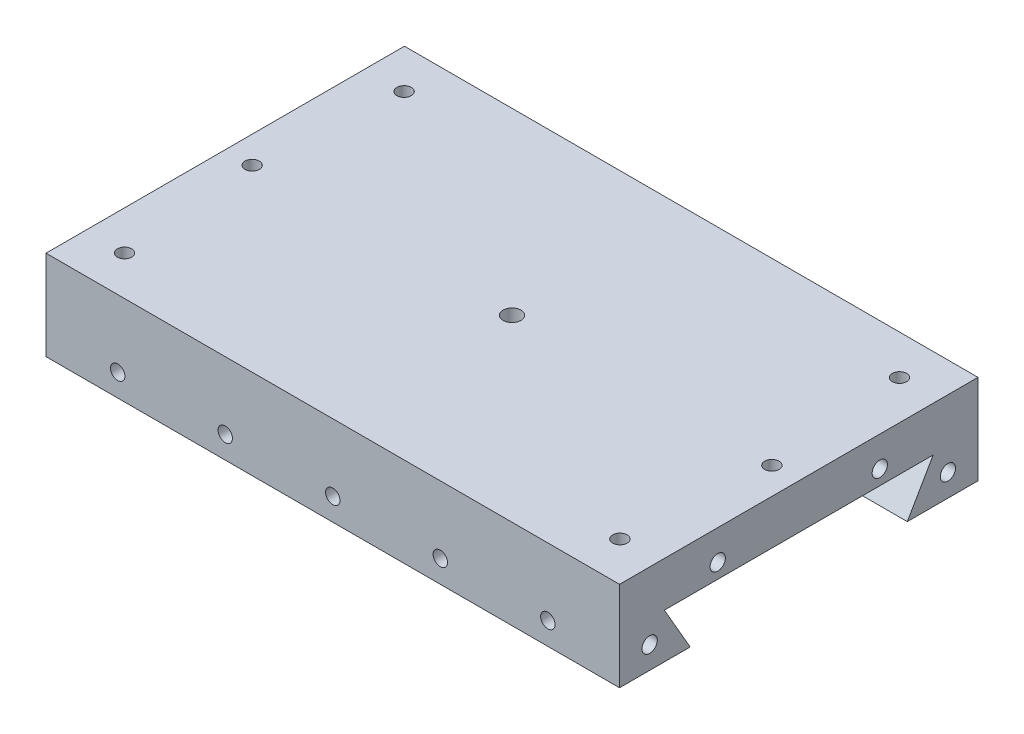
ISO-10303-21;
HEADER;
FILE_DESCRIPTION(('STEP AP214'),'2;1');
FILE_NAME('part.step','',(''),(''),'','','');
FILE_SCHEMA(('AUTOMOTIVE_DESIGN { 1 0 10303 214 1 1 1 1 }'));
ENDSEC;
DATA;
#1=APPLICATION_CONTEXT('core data for automotive mechanical design processes');
#2=APPLICATION_PROTOCOL_DEFINITION('international standard','automotive_design',2000,#1);
#3=PRODUCT_CONTEXT('',#1,'mechanical');
#4=PRODUCT('Part','Part','',(#3));
#5=PRODUCT_RELATED_PRODUCT_CATEGORY('part','',(#4));
#6=PRODUCT_DEFINITION_FORMATION('','',#4);
#7=PRODUCT_DEFINITION_CONTEXT('part definition',#1,'design');
#8=PRODUCT_DEFINITION('design','',#6,#7);
#9=PRODUCT_DEFINITION_SHAPE('','',#8);
#10=(LENGTH_UNIT() NAMED_UNIT(*) SI_UNIT(.MILLI.,.METRE.));
#11=(NAMED_UNIT(*) PLANE_ANGLE_UNIT() SI_UNIT($,.RADIAN.));
#12=(NAMED_UNIT(*) SI_UNIT($,.STERADIAN.) SOLID_ANGLE_UNIT());
#13=UNCERTAINTY_MEASURE_WITH_UNIT(LENGTH_MEASURE(1.E-05),#10,'distance_accuracy_value','');
#14=(GEOMETRIC_REPRESENTATION_CONTEXT(3) GLOBAL_UNCERTAINTY_ASSIGNED_CONTEXT((#13)) GLOBAL_UNIT_ASSIGNED_CONTEXT((#10,
#11,#12)) REPRESENTATION_CONTEXT('',''));
#15=CARTESIAN_POINT('',(0.,0.,0.));
#16=DIRECTION('',(0.,0.,1.));
#17=DIRECTION('',(1.,0.,0.));
#18=AXIS2_PLACEMENT_3D('',#15,#16,#17);
#19=CARTESIAN_POINT('',(203.2,0.,0.));
#20=DIRECTION('',(0.,-1.,0.));
#21=DIRECTION('',(0.,0.,-1.));
#22=AXIS2_PLACEMENT_3D('',#19,#20,#21);
#23=PLANE('',#22);
#24=DIRECTION('',(0.,0.,1.));
#25=VECTOR('',#24,1.);
#26=CARTESIAN_POINT('',(0.,0.,0.));
#27=LINE('',#26,#25);
#28=CARTESIAN_POINT('',(0.,0.,38.4595644766147));
#29=VERTEX_POINT('',#28);
#30=CARTESIAN_POINT('',(0.,0.,63.5));
#31=VERTEX_POINT('',#30);
#32=EDGE_CURVE('E135',#29,#31,#27,.T.);
#33=ORIENTED_EDGE('',*,*,#32,.F.);
#34=DIRECTION('',(-1.,0.,0.));
#35=VECTOR('',#34,1.);
#36=CARTESIAN_POINT('',(203.2,0.,38.4595644766147));
#37=LINE('',#36,#35);
#38=CARTESIAN_POINT('',(203.2,0.,38.4595644766147));
#39=VERTEX_POINT('',#38);
#40=EDGE_CURVE('E11',#39,#29,#37,.T.);
#41=ORIENTED_EDGE('',*,*,#40,.F.);
#42=DIRECTION('',(0.,0.,1.));
#43=VECTOR('',#42,1.);
#44=CARTESIAN_POINT('',(203.2,0.,0.));
#45=LINE('',#44,#43);
#46=CARTESIAN_POINT('',(203.2,0.,63.5));
#47=VERTEX_POINT('',#46);
#48=EDGE_CURVE('E155',#39,#47,#45,.T.);
#49=ORIENTED_EDGE('',*,*,#48,.T.);
#50=DIRECTION('',(-1.,0.,0.));
#51=VECTOR('',#50,1.);
#52=CARTESIAN_POINT('',(203.2,0.,63.5));
#53=LINE('',#52,#51);
#54=EDGE_CURVE('E54',#47,#31,#53,.T.);
#55=ORIENTED_EDGE('',*,*,#54,.T.);
#56=EDGE_LOOP('',(#33,#41,#49,#55));
#57=FACE_BOUND('',#56,.T.);
#58=ADVANCED_FACE('F38',(#57),#23,.T.);
#59=CARTESIAN_POINT('',(203.2,-16.6534799276169,28.8446733574611));
#60=DIRECTION('',(0.,-0.499999999999998,0.86602540378444));
#61=DIRECTION('',(0.,-0.86602540378444,-0.499999999999998));
#62=AXIS2_PLACEMENT_3D('',#59,#60,#61);
#63=PLANE('',#62);
#64=CARTESIAN_POINT('',(25.4,7.9375,43.0422822383073));
#65=DIRECTION('',(0.,-0.499999999999998,0.86602540378444));
#66=DIRECTION('',(0.,-0.86602540378444,-0.499999999999998));
#67=AXIS2_PLACEMENT_3D('',#64,#65,#66);
#68=ELLIPSE('',#67,2.9476040643207,2.55269999999999);
#69=CARTESIAN_POINT('',(25.4,5.38480000000001,41.568480206147));
#70=VERTEX_POINT('',#69);
#71=EDGE_CURVE('E299',#70,#70,#68,.T.);
#72=ORIENTED_EDGE('',*,*,#71,.T.);
#73=EDGE_LOOP('',(#72));
#74=FACE_BOUND('',#73,.T.);
#75=CARTESIAN_POINT('',(63.5,7.9375,43.0422822383073));
#76=DIRECTION('',(0.,-0.499999999999998,0.86602540378444));
#77=DIRECTION('',(0.,-0.86602540378444,-0.499999999999998));
#78=AXIS2_PLACEMENT_3D('',#75,#76,#77);
#79=ELLIPSE('',#78,2.94760406432071,2.5527);
#80=CARTESIAN_POINT('',(63.5,5.3848,41.568480206147));
#81=VERTEX_POINT('',#80);
#82=EDGE_CURVE('E293',#81,#81,#79,.T.);
#83=ORIENTED_EDGE('',*,*,#82,.T.);
#84=EDGE_LOOP('',(#83));
#85=FACE_BOUND('',#84,.T.);
#86=CARTESIAN_POINT('',(101.6,7.9375,43.0422822383073));
#87=DIRECTION('',(0.,-0.499999999999998,0.86602540378444));
#88=DIRECTION('',(0.,-0.86602540378444,-0.499999999999998));
#89=AXIS2_PLACEMENT_3D('',#86,#87,#88);
#90=ELLIPSE('',#89,2.94760406432071,2.5527);
#91=CARTESIAN_POINT('',(101.6,5.3848,41.568480206147));
#92=VERTEX_POINT('',#91);
#93=EDGE_CURVE('E287',#92,#92,#90,.T.);
#94=ORIENTED_EDGE('',*,*,#93,.T.);
#95=EDGE_LOOP('',(#94));
#96=FACE_BOUND('',#95,.T.);
#97=CARTESIAN_POINT('',(139.7,7.9375,43.0422822383073));
#98=DIRECTION('',(0.,-0.499999999999998,0.86602540378444));
#99=DIRECTION('',(0.,-0.86602540378444,-0.499999999999998));
#100=AXIS2_PLACEMENT_3D('',#97,#98,#99);
#101=ELLIPSE('',#100,2.9476040643207,2.55269999999999);
#102=CARTESIAN_POINT('',(139.7,5.38480000000001,41.568480206147));
#103=VERTEX_POINT('',#102);
#104=EDGE_CURVE('E281',#103,#103,#101,.T.);
#105=ORIENTED_EDGE('',*,*,#104,.T.);
#106=EDGE_LOOP('',(#105));
#107=FACE_BOUND('',#106,.T.);
#108=CARTESIAN_POINT('',(177.8,7.9375,43.0422822383073));
#109=DIRECTION('',(0.,-0.499999999999998,0.86602540378444));
#110=DIRECTION('',(0.,-0.86602540378444,-0.499999999999998));
#111=AXIS2_PLACEMENT_3D('',#108,#109,#110);
#112=ELLIPSE('',#111,2.9476040643207,2.55269999999999);
#113=CARTESIAN_POINT('',(177.8,5.38480000000001,41.568480206147));
#114=VERTEX_POINT('',#113);
#115=EDGE_CURVE('E275',#114,#114,#112,.T.);
#116=ORIENTED_EDGE('',*,*,#115,.T.);
#117=EDGE_LOOP('',(#116));
#118=FACE_BOUND('',#117,.T.);
#119=DIRECTION('',(0.,0.86602540378444,0.499999999999998));
#120=VECTOR('',#119,1.);
#121=CARTESIAN_POINT('',(0.,-16.6534799276169,28.8446733574611));
#122=LINE('',#121,#120);
#123=CARTESIAN_POINT('',(0.,15.875,47.625));
#124=VERTEX_POINT('',#123);
#125=EDGE_CURVE('E137',#29,#124,#122,.T.);
#126=ORIENTED_EDGE('',*,*,#125,.T.);
#127=DIRECTION('',(-1.,0.,0.));
#128=VECTOR('',#127,1.);
#129=CARTESIAN_POINT('',(203.2,15.875,47.625));
#130=LINE('',#129,#128);
#131=CARTESIAN_POINT('',(203.2,15.875,47.625));
#132=VERTEX_POINT('',#131);
#133=EDGE_CURVE('E46',#132,#124,#130,.T.);
#134=ORIENTED_EDGE('',*,*,#133,.F.);
#135=DIRECTION('',(0.,0.86602540378444,0.499999999999998));
#136=VECTOR('',#135,1.);
#137=CARTESIAN_POINT('',(203.2,-16.6534799276169,28.8446733574611));
#138=LINE('',#137,#136);
#139=EDGE_CURVE('E181',#39,#132,#138,.T.);
#140=ORIENTED_EDGE('',*,*,#139,.F.);
#141=ORIENTED_EDGE('',*,*,#40,.T.);
#142=EDGE_LOOP('',(#126,#134,#140,#141));
#143=FACE_BOUND('',#142,.T.);
#144=ADVANCED_FACE('F321',(#74,#85,#96,#107,#118,#143),#63,.F.);
#145=CARTESIAN_POINT('',(203.2,15.8749999999999,0.));
#146=DIRECTION('',(0.,1.,0.));
#147=DIRECTION('',(0.,0.,1.));
#148=AXIS2_PLACEMENT_3D('',#145,#146,#147);
#149=PLANE('',#148);
#150=DIRECTION('',(0.,0.,-1.));
#151=VECTOR('',#150,1.);
#152=CARTESIAN_POINT('',(0.,15.8749999999999,0.));
#153=LINE('',#152,#151);
#154=CARTESIAN_POINT('',(0.,15.875,-47.625));
#155=VERTEX_POINT('',#154);
#156=EDGE_CURVE('E140',#124,#155,#153,.T.);
#157=ORIENTED_EDGE('',*,*,#156,.T.);
#158=DIRECTION('',(-1.,0.,0.));
#159=VECTOR('',#158,1.);
#160=CARTESIAN_POINT('',(203.2,15.875,-47.625));
#161=LINE('',#160,#159);
#162=CARTESIAN_POINT('',(203.2,15.875,-47.625));
#163=VERTEX_POINT('',#162);
#164=EDGE_CURVE('E161',#163,#155,#161,.T.);
#165=ORIENTED_EDGE('',*,*,#164,.F.);
#166=DIRECTION('',(0.,0.,-1.));
#167=VECTOR('',#166,1.);
#168=CARTESIAN_POINT('',(203.2,15.8749999999999,0.));
#169=LINE('',#168,#167);
#170=EDGE_CURVE('E169',#132,#163,#169,.T.);
#171=ORIENTED_EDGE('',*,*,#170,.F.);
#172=ORIENTED_EDGE('',*,*,#133,.T.);
#173=EDGE_LOOP('',(#157,#165,#171,#172));
#174=FACE_BOUND('',#173,.T.);
#175=ADVANCED_FACE('F167',(#174),#149,.F.);
#176=CARTESIAN_POINT('',(203.2,-16.653479927617,-28.8446733574608));
#177=DIRECTION('',(0.,0.500000000000005,0.866025403784436));
#178=DIRECTION('',(0.,-0.866025403784436,0.500000000000005));
#179=AXIS2_PLACEMENT_3D('',#176,#177,#178);
#180=PLANE('',#179);
#181=DIRECTION('',(0.,0.866025403784436,-0.500000000000005));
#182=VECTOR('',#181,1.);
#183=CARTESIAN_POINT('',(0.,-16.653479927617,-28.8446733574608));
#184=LINE('',#183,#182);
#185=CARTESIAN_POINT('',(0.,0.,-38.4595644766146));
#186=VERTEX_POINT('',#185);
#187=EDGE_CURVE('E143',#186,#155,#184,.T.);
#188=ORIENTED_EDGE('',*,*,#187,.F.);
#189=DIRECTION('',(-1.,0.,0.));
#190=VECTOR('',#189,1.);
#191=CARTESIAN_POINT('',(203.2,0.,-38.4595644766146));
#192=LINE('',#191,#190);
#193=CARTESIAN_POINT('',(203.2,0.,-38.4595644766146));
#194=VERTEX_POINT('',#193);
#195=EDGE_CURVE('E159',#194,#186,#192,.T.);
#196=ORIENTED_EDGE('',*,*,#195,.F.);
#197=DIRECTION('',(0.,0.866025403784436,-0.500000000000005));
#198=VECTOR('',#197,1.);
#199=CARTESIAN_POINT('',(203.2,-16.653479927617,-28.8446733574608));
#200=LINE('',#199,#198);
#201=EDGE_CURVE('E179',#194,#163,#200,.T.);
#202=ORIENTED_EDGE('',*,*,#201,.T.);
#203=ORIENTED_EDGE('',*,*,#164,.T.);
#204=EDGE_LOOP('',(#188,#196,#202,#203));
#205=FACE_BOUND('',#204,.T.);
#206=ADVANCED_FACE('F177',(#205),#180,.T.);
#207=CARTESIAN_POINT('',(203.2,0.,0.));
#208=DIRECTION('',(0.,-1.,0.));
#209=DIRECTION('',(0.,0.,-1.));
#210=AXIS2_PLACEMENT_3D('',#207,#208,#209);
#211=PLANE('',#210);
#212=DIRECTION('',(0.,0.,1.));
#213=VECTOR('',#212,1.);
#214=CARTESIAN_POINT('',(0.,0.,0.));
#215=LINE('',#214,#213);
#216=CARTESIAN_POINT('',(0.,0.,-63.5));
#217=VERTEX_POINT('',#216);
#218=EDGE_CURVE('E146',#217,#186,#215,.T.);
#219=ORIENTED_EDGE('',*,*,#218,.F.);
#220=DIRECTION('',(-1.,0.,0.));
#221=VECTOR('',#220,1.);
#222=CARTESIAN_POINT('',(203.2,0.,-63.5));
#223=LINE('',#222,#221);
#224=CARTESIAN_POINT('',(203.2,0.,-63.5));
#225=VERTEX_POINT('',#224);
#226=EDGE_CURVE('E116',#225,#217,#223,.T.);
#227=ORIENTED_EDGE('',*,*,#226,.F.);
#228=DIRECTION('',(0.,0.,1.));
#229=VECTOR('',#228,1.);
#230=CARTESIAN_POINT('',(203.2,0.,0.));
#231=LINE('',#230,#229);
#232=EDGE_CURVE('E127',#225,#194,#231,.T.);
#233=ORIENTED_EDGE('',*,*,#232,.T.);
#234=ORIENTED_EDGE('',*,*,#195,.T.);
#235=EDGE_LOOP('',(#219,#227,#233,#234));
#236=FACE_BOUND('',#235,.T.);
#237=ADVANCED_FACE('F334',(#236),#211,.T.);
#238=CARTESIAN_POINT('',(203.2,0.,-63.5));
#239=DIRECTION('',(0.,0.,-1.));
#240=DIRECTION('',(-1.,0.,0.));
#241=AXIS2_PLACEMENT_3D('',#238,#239,#240);
#242=PLANE('',#241);
#243=DIRECTION('',(0.,-1.,0.));
#244=VECTOR('',#243,1.);
#245=CARTESIAN_POINT('',(0.,0.,-63.5));
#246=LINE('',#245,#244);
#247=CARTESIAN_POINT('',(0.,31.75,-63.5));
#248=VERTEX_POINT('',#247);
#249=EDGE_CURVE('E112',#248,#217,#246,.T.);
#250=ORIENTED_EDGE('',*,*,#249,.F.);
#251=DIRECTION('',(-1.,0.,0.));
#252=VECTOR('',#251,1.);
#253=CARTESIAN_POINT('',(203.2,31.75,-63.5));
#254=LINE('',#253,#252);
#255=CARTESIAN_POINT('',(203.2,31.75,-63.5));
#256=VERTEX_POINT('',#255);
#257=EDGE_CURVE('E107',#256,#248,#254,.T.);
#258=ORIENTED_EDGE('',*,*,#257,.F.);
#259=DIRECTION('',(0.,-1.,0.));
#260=VECTOR('',#259,1.);
#261=CARTESIAN_POINT('',(203.2,0.,-63.5));
#262=LINE('',#261,#260);
#263=EDGE_CURVE('E110',#256,#225,#262,.T.);
#264=ORIENTED_EDGE('',*,*,#263,.T.);
#265=ORIENTED_EDGE('',*,*,#226,.T.);
#266=EDGE_LOOP('',(#250,#258,#264,#265));
#267=FACE_BOUND('',#266,.T.);
#268=ADVANCED_FACE('F109',(#267),#242,.T.);
#269=CARTESIAN_POINT('',(203.2,31.75,0.));
#270=DIRECTION('',(0.,1.,0.));
#271=DIRECTION('',(0.,0.,1.));
#272=AXIS2_PLACEMENT_3D('',#269,#270,#271);
#273=PLANE('',#272);
#274=CARTESIAN_POINT('',(101.6,31.7500000000001,0.));
#275=DIRECTION('',(0.,1.,0.));
#276=DIRECTION('',(0.,0.,1.));
#277=AXIS2_PLACEMENT_3D('',#274,#275,#276);
#278=CIRCLE('',#277,3.17499999999998);
#279=CARTESIAN_POINT('',(101.6,31.7500000000001,3.17499999999993));
#280=VERTEX_POINT('',#279);
#281=EDGE_CURVE('E272',#280,#280,#278,.T.);
#282=ORIENTED_EDGE('',*,*,#281,.F.);
#283=EDGE_LOOP('',(#282));
#284=FACE_BOUND('',#283,.T.);
#285=CARTESIAN_POINT('',(13.843,31.75,49.53));
#286=DIRECTION('',(0.,1.,0.));
#287=DIRECTION('',(0.,0.,1.));
#288=AXIS2_PLACEMENT_3D('',#285,#286,#287);
#289=CIRCLE('',#288,2.5527);
#290=CARTESIAN_POINT('',(13.843,31.75,52.0826999999999));
#291=VERTEX_POINT('',#290);
#292=EDGE_CURVE('E266',#291,#291,#289,.T.);
#293=ORIENTED_EDGE('',*,*,#292,.F.);
#294=EDGE_LOOP('',(#293));
#295=FACE_BOUND('',#294,.T.);
#296=CARTESIAN_POINT('',(9.52500000000003,31.75,0.));
#297=DIRECTION('',(0.,1.,0.));
#298=DIRECTION('',(0.,0.,1.));
#299=AXIS2_PLACEMENT_3D('',#296,#297,#298);
#300=CIRCLE('',#299,2.5527);
#301=CARTESIAN_POINT('',(9.52500000000003,31.75,2.55269999999995));
#302=VERTEX_POINT('',#301);
#303=EDGE_CURVE('E260',#302,#302,#300,.T.);
#304=ORIENTED_EDGE('',*,*,#303,.F.);
#305=EDGE_LOOP('',(#304));
#306=FACE_BOUND('',#305,.T.);
#307=CARTESIAN_POINT('',(13.843,31.75,-49.53));
#308=DIRECTION('',(0.,1.,0.));
#309=DIRECTION('',(0.,0.,1.));
#310=AXIS2_PLACEMENT_3D('',#307,#308,#309);
#311=CIRCLE('',#310,2.5527);
#312=CARTESIAN_POINT('',(13.843,31.75,-46.9773));
#313=VERTEX_POINT('',#312);
#314=EDGE_CURVE('E254',#313,#313,#311,.T.);
#315=ORIENTED_EDGE('',*,*,#314,.F.);
#316=EDGE_LOOP('',(#315));
#317=FACE_BOUND('',#316,.T.);
#318=CARTESIAN_POINT('',(189.357,31.75,-49.53));
#319=DIRECTION('',(0.,1.,0.));
#320=DIRECTION('',(0.,0.,1.));
#321=AXIS2_PLACEMENT_3D('',#318,#319,#320);
#322=CIRCLE('',#321,2.55269999999999);
#323=CARTESIAN_POINT('',(189.357,31.75,-46.9773000000001));
#324=VERTEX_POINT('',#323);
#325=EDGE_CURVE('E248',#324,#324,#322,.T.);
#326=ORIENTED_EDGE('',*,*,#325,.F.);
#327=EDGE_LOOP('',(#326));
#328=FACE_BOUND('',#327,.T.);
#329=CARTESIAN_POINT('',(193.675,31.75,0.));
#330=DIRECTION('',(0.,1.,0.));
#331=DIRECTION('',(0.,0.,1.));
#332=AXIS2_PLACEMENT_3D('',#329,#330,#331);
#333=CIRCLE('',#332,2.55269999999999);
#334=CARTESIAN_POINT('',(193.675,31.75,2.55269999999994));
#335=VERTEX_POINT('',#334);
#336=EDGE_CURVE('E242',#335,#335,#333,.T.);
#337=ORIENTED_EDGE('',*,*,#336,.F.);
#338=EDGE_LOOP('',(#337));
#339=FACE_BOUND('',#338,.T.);
#340=CARTESIAN_POINT('',(189.357,31.75,49.53));
#341=DIRECTION('',(0.,1.,0.));
#342=DIRECTION('',(0.,0.,1.));
#343=AXIS2_PLACEMENT_3D('',#340,#341,#342);
#344=CIRCLE('',#343,2.55269999999999);
#345=CARTESIAN_POINT('',(189.357,31.75,52.0826999999999));
#346=VERTEX_POINT('',#345);
#347=EDGE_CURVE('E236',#346,#346,#344,.T.);
#348=ORIENTED_EDGE('',*,*,#347,.F.);
#349=EDGE_LOOP('',(#348));
#350=FACE_BOUND('',#349,.T.);
#351=DIRECTION('',(0.,0.,-1.));
#352=VECTOR('',#351,1.);
#353=CARTESIAN_POINT('',(0.,31.75,0.));
#354=LINE('',#353,#352);
#355=CARTESIAN_POINT('',(0.,31.75,63.5));
#356=VERTEX_POINT('',#355);
#357=EDGE_CURVE('E150',#356,#248,#354,.T.);
#358=ORIENTED_EDGE('',*,*,#357,.F.);
#359=DIRECTION('',(-1.,0.,0.));
#360=VECTOR('',#359,1.);
#361=CARTESIAN_POINT('',(203.2,31.75,63.5));
#362=LINE('',#361,#360);
#363=CARTESIAN_POINT('',(203.2,31.75,63.5));
#364=VERTEX_POINT('',#363);
#365=EDGE_CURVE('E80',#364,#356,#362,.T.);
#366=ORIENTED_EDGE('',*,*,#365,.F.);
#367=DIRECTION('',(0.,0.,-1.));
#368=VECTOR('',#367,1.);
#369=CARTESIAN_POINT('',(203.2,31.75,0.));
#370=LINE('',#369,#368);
#371=EDGE_CURVE('E124',#364,#256,#370,.T.);
#372=ORIENTED_EDGE('',*,*,#371,.T.);
#373=ORIENTED_EDGE('',*,*,#257,.T.);
#374=EDGE_LOOP('',(#358,#366,#372,#373));
#375=FACE_BOUND('',#374,.T.);
#376=ADVANCED_FACE('F129',(#284,#295,#306,#317,#328,#339,#350,#375),#273,.T.);
#377=CARTESIAN_POINT('',(203.2,0.,63.5));
#378=DIRECTION('',(0.,0.,1.));
#379=DIRECTION('',(1.,0.,0.));
#380=AXIS2_PLACEMENT_3D('',#377,#378,#379);
#381=PLANE('',#380);
#382=CARTESIAN_POINT('',(25.4,7.9375,63.5));
#383=DIRECTION('',(0.,0.,1.));
#384=DIRECTION('',(1.,0.,0.));
#385=AXIS2_PLACEMENT_3D('',#382,#383,#384);
#386=CIRCLE('',#385,2.55269999999999);
#387=CARTESIAN_POINT('',(27.9527,7.9375,63.5));
#388=VERTEX_POINT('',#387);
#389=EDGE_CURVE('E302',#388,#388,#386,.T.);
#390=ORIENTED_EDGE('',*,*,#389,.F.);
#391=EDGE_LOOP('',(#390));
#392=FACE_BOUND('',#391,.T.);
#393=CARTESIAN_POINT('',(63.5,7.9375,63.5));
#394=DIRECTION('',(0.,0.,1.));
#395=DIRECTION('',(1.,0.,0.));
#396=AXIS2_PLACEMENT_3D('',#393,#394,#395);
#397=CIRCLE('',#396,2.5527);
#398=CARTESIAN_POINT('',(66.0527,7.9375,63.5));
#399=VERTEX_POINT('',#398);
#400=EDGE_CURVE('E296',#399,#399,#397,.T.);
#401=ORIENTED_EDGE('',*,*,#400,.F.);
#402=EDGE_LOOP('',(#401));
#403=FACE_BOUND('',#402,.T.);
#404=CARTESIAN_POINT('',(101.6,7.9375,63.5));
#405=DIRECTION('',(0.,0.,1.));
#406=DIRECTION('',(1.,0.,0.));
#407=AXIS2_PLACEMENT_3D('',#404,#405,#406);
#408=CIRCLE('',#407,2.5527);
#409=CARTESIAN_POINT('',(104.1527,7.9375,63.5));
#410=VERTEX_POINT('',#409);
#411=EDGE_CURVE('E290',#410,#410,#408,.T.);
#412=ORIENTED_EDGE('',*,*,#411,.F.);
#413=EDGE_LOOP('',(#412));
#414=FACE_BOUND('',#413,.T.);
#415=CARTESIAN_POINT('',(139.7,7.9375,63.5));
#416=DIRECTION('',(0.,0.,1.));
#417=DIRECTION('',(1.,0.,0.));
#418=AXIS2_PLACEMENT_3D('',#415,#416,#417);
#419=CIRCLE('',#418,2.55269999999999);
#420=CARTESIAN_POINT('',(142.2527,7.9375,63.5));
#421=VERTEX_POINT('',#420);
#422=EDGE_CURVE('E284',#421,#421,#419,.T.);
#423=ORIENTED_EDGE('',*,*,#422,.F.);
#424=EDGE_LOOP('',(#423));
#425=FACE_BOUND('',#424,.T.);
#426=CARTESIAN_POINT('',(177.8,7.9375,63.5));
#427=DIRECTION('',(0.,0.,1.));
#428=DIRECTION('',(1.,0.,0.));
#429=AXIS2_PLACEMENT_3D('',#426,#427,#428);
#430=CIRCLE('',#429,2.55269999999999);
#431=CARTESIAN_POINT('',(180.3527,7.9375,63.5));
#432=VERTEX_POINT('',#431);
#433=EDGE_CURVE('E278',#432,#432,#430,.T.);
#434=ORIENTED_EDGE('',*,*,#433,.F.);
#435=EDGE_LOOP('',(#434));
#436=FACE_BOUND('',#435,.T.);
#437=DIRECTION('',(0.,1.,0.));
#438=VECTOR('',#437,1.);
#439=CARTESIAN_POINT('',(0.,0.,63.5));
#440=LINE('',#439,#438);
#441=EDGE_CURVE('E152',#31,#356,#440,.T.);
#442=ORIENTED_EDGE('',*,*,#441,.F.);
#443=ORIENTED_EDGE('',*,*,#54,.F.);
#444=DIRECTION('',(0.,1.,0.));
#445=VECTOR('',#444,1.);
#446=CARTESIAN_POINT('',(203.2,0.,63.5));
#447=LINE('',#446,#445);
#448=EDGE_CURVE('E130',#47,#364,#447,.T.);
#449=ORIENTED_EDGE('',*,*,#448,.T.);
#450=ORIENTED_EDGE('',*,*,#365,.T.);
#451=EDGE_LOOP('',(#442,#443,#449,#450));
#452=FACE_BOUND('',#451,.T.);
#453=ADVANCED_FACE('F309',(#392,#403,#414,#425,#436,#452),#381,.T.);
#454=CARTESIAN_POINT('',(203.2,0.,0.));
#455=DIRECTION('',(1.,0.,0.));
#456=DIRECTION('',(0.,0.,-1.));
#457=AXIS2_PLACEMENT_3D('',#454,#455,#456);
#458=PLANE('',#457);
#459=CARTESIAN_POINT('',(203.2,7.93750000000001,52.832));
#460=DIRECTION('',(1.,0.,0.));
#461=DIRECTION('',(0.,0.,-1.));
#462=AXIS2_PLACEMENT_3D('',#459,#460,#461);
#463=CIRCLE('',#462,2.7051);
#464=CARTESIAN_POINT('',(203.2,7.93750000000001,50.1269));
#465=VERTEX_POINT('',#464);
#466=EDGE_CURVE('E230',#465,#465,#463,.T.);
#467=ORIENTED_EDGE('',*,*,#466,.F.);
#468=EDGE_LOOP('',(#467));
#469=FACE_BOUND('',#468,.T.);
#470=CARTESIAN_POINT('',(203.2,21.082,28.702));
#471=DIRECTION('',(1.,0.,0.));
#472=DIRECTION('',(0.,0.,-1.));
#473=AXIS2_PLACEMENT_3D('',#470,#471,#472);
#474=CIRCLE('',#473,2.7051);
#475=CARTESIAN_POINT('',(203.2,21.082,25.9969));
#476=VERTEX_POINT('',#475);
#477=EDGE_CURVE('E224',#476,#476,#474,.T.);
#478=ORIENTED_EDGE('',*,*,#477,.F.);
#479=EDGE_LOOP('',(#478));
#480=FACE_BOUND('',#479,.T.);
#481=CARTESIAN_POINT('',(203.2,21.082,-28.702));
#482=DIRECTION('',(1.,0.,0.));
#483=DIRECTION('',(0.,0.,-1.));
#484=AXIS2_PLACEMENT_3D('',#481,#482,#483);
#485=CIRCLE('',#484,2.7051);
#486=CARTESIAN_POINT('',(203.2,21.082,-31.4071));
#487=VERTEX_POINT('',#486);
#488=EDGE_CURVE('E218',#487,#487,#485,.T.);
#489=ORIENTED_EDGE('',*,*,#488,.F.);
#490=EDGE_LOOP('',(#489));
#491=FACE_BOUND('',#490,.T.);
#492=CARTESIAN_POINT('',(203.2,7.93750000000001,-52.832));
#493=DIRECTION('',(1.,0.,0.));
#494=DIRECTION('',(0.,0.,-1.));
#495=AXIS2_PLACEMENT_3D('',#492,#493,#494);
#496=CIRCLE('',#495,2.7051);
#497=CARTESIAN_POINT('',(203.2,7.93750000000001,-55.5371));
#498=VERTEX_POINT('',#497);
#499=EDGE_CURVE('E212',#498,#498,#496,.T.);
#500=ORIENTED_EDGE('',*,*,#499,.F.);
#501=EDGE_LOOP('',(#500));
#502=FACE_BOUND('',#501,.T.);
#503=ORIENTED_EDGE('',*,*,#48,.F.);
#504=ORIENTED_EDGE('',*,*,#139,.T.);
#505=ORIENTED_EDGE('',*,*,#170,.T.);
#506=ORIENTED_EDGE('',*,*,#201,.F.);
#507=ORIENTED_EDGE('',*,*,#232,.F.);
#508=ORIENTED_EDGE('',*,*,#263,.F.);
#509=ORIENTED_EDGE('',*,*,#371,.F.);
#510=ORIENTED_EDGE('',*,*,#448,.F.);
#511=EDGE_LOOP('',(#503,#504,#505,#506,#507,#508,#509,#510));
#512=FACE_BOUND('',#511,.T.);
#513=ADVANCED_FACE('F122',(#469,#480,#491,#502,#512),#458,.T.);
#514=CARTESIAN_POINT('',(0.,0.,0.));
#515=DIRECTION('',(1.,0.,0.));
#516=DIRECTION('',(0.,0.,-1.));
#517=AXIS2_PLACEMENT_3D('',#514,#515,#516);
#518=PLANE('',#517);
#519=CARTESIAN_POINT('',(0.,7.93750000000001,-52.832));
#520=DIRECTION('',(-1.,0.,0.));
#521=DIRECTION('',(0.,0.,1.));
#522=AXIS2_PLACEMENT_3D('',#519,#520,#521);
#523=CIRCLE('',#522,2.5527);
#524=CARTESIAN_POINT('',(0.,7.93750000000001,-50.2793));
#525=VERTEX_POINT('',#524);
#526=EDGE_CURVE('E206',#525,#525,#523,.T.);
#527=ORIENTED_EDGE('',*,*,#526,.F.);
#528=EDGE_LOOP('',(#527));
#529=FACE_BOUND('',#528,.T.);
#530=CARTESIAN_POINT('',(0.,21.082,-28.702));
#531=DIRECTION('',(-1.,0.,0.));
#532=DIRECTION('',(0.,0.,1.));
#533=AXIS2_PLACEMENT_3D('',#530,#531,#532);
#534=CIRCLE('',#533,2.5527);
#535=CARTESIAN_POINT('',(0.,21.082,-26.1493));
#536=VERTEX_POINT('',#535);
#537=EDGE_CURVE('E200',#536,#536,#534,.T.);
#538=ORIENTED_EDGE('',*,*,#537,.F.);
#539=EDGE_LOOP('',(#538));
#540=FACE_BOUND('',#539,.T.);
#541=CARTESIAN_POINT('',(0.,21.082,28.702));
#542=DIRECTION('',(-1.,0.,0.));
#543=DIRECTION('',(0.,0.,1.));
#544=AXIS2_PLACEMENT_3D('',#541,#542,#543);
#545=CIRCLE('',#544,2.5527);
#546=CARTESIAN_POINT('',(0.,21.082,31.2547));
#547=VERTEX_POINT('',#546);
#548=EDGE_CURVE('E194',#547,#547,#545,.T.);
#549=ORIENTED_EDGE('',*,*,#548,.F.);
#550=EDGE_LOOP('',(#549));
#551=FACE_BOUND('',#550,.T.);
#552=CARTESIAN_POINT('',(0.,7.93750000000001,52.832));
#553=DIRECTION('',(-1.,0.,0.));
#554=DIRECTION('',(0.,0.,1.));
#555=AXIS2_PLACEMENT_3D('',#552,#553,#554);
#556=CIRCLE('',#555,2.5527);
#557=CARTESIAN_POINT('',(0.,7.93750000000001,55.3847));
#558=VERTEX_POINT('',#557);
#559=EDGE_CURVE('E188',#558,#558,#556,.T.);
#560=ORIENTED_EDGE('',*,*,#559,.F.);
#561=EDGE_LOOP('',(#560));
#562=FACE_BOUND('',#561,.T.);
#563=ORIENTED_EDGE('',*,*,#32,.T.);
#564=ORIENTED_EDGE('',*,*,#441,.T.);
#565=ORIENTED_EDGE('',*,*,#357,.T.);
#566=ORIENTED_EDGE('',*,*,#249,.T.);
#567=ORIENTED_EDGE('',*,*,#218,.T.);
#568=ORIENTED_EDGE('',*,*,#187,.T.);
#569=ORIENTED_EDGE('',*,*,#156,.F.);
#570=ORIENTED_EDGE('',*,*,#125,.F.);
#571=EDGE_LOOP('',(#563,#564,#565,#566,#567,#568,#569,#570));
#572=FACE_BOUND('',#571,.T.);
#573=ADVANCED_FACE('F173',(#529,#540,#551,#562,#572),#518,.F.);
#574=CARTESIAN_POINT('',(16.51,7.93750000000001,52.832));
#575=DIRECTION('',(-1.,0.,0.));
#576=DIRECTION('',(0.,0.,1.));
#577=AXIS2_PLACEMENT_3D('',#574,#575,#576);
#578=CONICAL_SURFACE('',#577,2.5527,1.02974425867665);
#579=CARTESIAN_POINT('',(18.0438169021917,7.9375,52.832));
#580=VERTEX_POINT('',#579);
#581=VERTEX_LOOP('',#580);
#582=FACE_BOUND('',#581,.T.);
#583=CARTESIAN_POINT('',(16.51,7.93750000000001,52.832));
#584=DIRECTION('',(-1.,0.,0.));
#585=DIRECTION('',(0.,0.,1.));
#586=AXIS2_PLACEMENT_3D('',#583,#584,#585);
#587=CIRCLE('',#586,2.5527);
#588=CARTESIAN_POINT('',(16.51,7.93750000000001,55.3847));
#589=VERTEX_POINT('',#588);
#590=EDGE_CURVE('E138',#589,#589,#587,.T.);
#591=ORIENTED_EDGE('',*,*,#590,.T.);
#592=EDGE_LOOP('',(#591));
#593=FACE_BOUND('',#592,.T.);
#594=ADVANCED_FACE('F345',(#582,#593),#578,.F.);
#595=CARTESIAN_POINT('',(0.,7.93750000000001,52.832));
#596=DIRECTION('',(-1.,0.,0.));
#597=DIRECTION('',(0.,0.,1.));
#598=AXIS2_PLACEMENT_3D('',#595,#596,#597);
#599=CYLINDRICAL_SURFACE('',#598,2.5527);
#600=ORIENTED_EDGE('',*,*,#590,.F.);
#601=EDGE_LOOP('',(#600));
#602=FACE_BOUND('',#601,.T.);
#603=ORIENTED_EDGE('',*,*,#559,.T.);
#604=EDGE_LOOP('',(#603));
#605=FACE_BOUND('',#604,.T.);
#606=ADVANCED_FACE('F352',(#602,#605),#599,.F.);
#607=CARTESIAN_POINT('',(16.51,21.082,28.702));
#608=DIRECTION('',(-1.,0.,0.));
#609=DIRECTION('',(0.,0.,1.));
#610=AXIS2_PLACEMENT_3D('',#607,#608,#609);
#611=CONICAL_SURFACE('',#610,2.5527,1.02974425867665);
#612=CARTESIAN_POINT('',(18.0438169021917,21.082,28.702));
#613=VERTEX_POINT('',#612);
#614=VERTEX_LOOP('',#613);
#615=FACE_BOUND('',#614,.T.);
#616=CARTESIAN_POINT('',(16.51,21.082,28.702));
#617=DIRECTION('',(-1.,0.,0.));
#618=DIRECTION('',(0.,0.,1.));
#619=AXIS2_PLACEMENT_3D('',#616,#617,#618);
#620=CIRCLE('',#619,2.5527);
#621=CARTESIAN_POINT('',(16.51,21.082,31.2547));
#622=VERTEX_POINT('',#621);
#623=EDGE_CURVE('E191',#622,#622,#620,.T.);
#624=ORIENTED_EDGE('',*,*,#623,.T.);
#625=EDGE_LOOP('',(#624));
#626=FACE_BOUND('',#625,.T.);
#627=ADVANCED_FACE('F356',(#615,#626),#611,.F.);
#628=CARTESIAN_POINT('',(0.,21.082,28.702));
#629=DIRECTION('',(-1.,0.,0.));
#630=DIRECTION('',(0.,0.,1.));
#631=AXIS2_PLACEMENT_3D('',#628,#629,#630);
#632=CYLINDRICAL_SURFACE('',#631,2.5527);
#633=ORIENTED_EDGE('',*,*,#623,.F.);
#634=EDGE_LOOP('',(#633));
#635=FACE_BOUND('',#634,.T.);
#636=ORIENTED_EDGE('',*,*,#548,.T.);
#637=EDGE_LOOP('',(#636));
#638=FACE_BOUND('',#637,.T.);
#639=ADVANCED_FACE('F360',(#635,#638),#632,.F.);
#640=CARTESIAN_POINT('',(16.51,21.082,-28.702));
#641=DIRECTION('',(-1.,0.,0.));
#642=DIRECTION('',(0.,0.,1.));
#643=AXIS2_PLACEMENT_3D('',#640,#641,#642);
#644=CONICAL_SURFACE('',#643,2.5527,1.02974425867665);
#645=CARTESIAN_POINT('',(18.0438169021917,21.082,-28.702));
#646=VERTEX_POINT('',#645);
#647=VERTEX_LOOP('',#646);
#648=FACE_BOUND('',#647,.T.);
#649=CARTESIAN_POINT('',(16.51,21.082,-28.702));
#650=DIRECTION('',(-1.,0.,0.));
#651=DIRECTION('',(0.,0.,1.));
#652=AXIS2_PLACEMENT_3D('',#649,#650,#651);
#653=CIRCLE('',#652,2.5527);
#654=CARTESIAN_POINT('',(16.51,21.082,-26.1493));
#655=VERTEX_POINT('',#654);
#656=EDGE_CURVE('E197',#655,#655,#653,.T.);
#657=ORIENTED_EDGE('',*,*,#656,.T.);
#658=EDGE_LOOP('',(#657));
#659=FACE_BOUND('',#658,.T.);
#660=ADVANCED_FACE('F364',(#648,#659),#644,.F.);
#661=CARTESIAN_POINT('',(0.,21.082,-28.702));
#662=DIRECTION('',(-1.,0.,0.));
#663=DIRECTION('',(0.,0.,1.));
#664=AXIS2_PLACEMENT_3D('',#661,#662,#663);
#665=CYLINDRICAL_SURFACE('',#664,2.5527);
#666=ORIENTED_EDGE('',*,*,#656,.F.);
#667=EDGE_LOOP('',(#666));
#668=FACE_BOUND('',#667,.T.);
#669=ORIENTED_EDGE('',*,*,#537,.T.);
#670=EDGE_LOOP('',(#669));
#671=FACE_BOUND('',#670,.T.);
#672=ADVANCED_FACE('F368',(#668,#671),#665,.F.);
#673=CARTESIAN_POINT('',(16.51,7.93750000000001,-52.832));
#674=DIRECTION('',(-1.,0.,0.));
#675=DIRECTION('',(0.,0.,1.));
#676=AXIS2_PLACEMENT_3D('',#673,#674,#675);
#677=CONICAL_SURFACE('',#676,2.5527,1.02974425867665);
#678=CARTESIAN_POINT('',(18.0438169021917,7.9375,-52.832));
#679=VERTEX_POINT('',#678);
#680=VERTEX_LOOP('',#679);
#681=FACE_BOUND('',#680,.T.);
#682=CARTESIAN_POINT('',(16.51,7.93750000000001,-52.832));
#683=DIRECTION('',(-1.,0.,0.));
#684=DIRECTION('',(0.,0.,1.));
#685=AXIS2_PLACEMENT_3D('',#682,#683,#684);
#686=CIRCLE('',#685,2.5527);
#687=CARTESIAN_POINT('',(16.51,7.93750000000001,-50.2793));
#688=VERTEX_POINT('',#687);
#689=EDGE_CURVE('E203',#688,#688,#686,.T.);
#690=ORIENTED_EDGE('',*,*,#689,.T.);
#691=EDGE_LOOP('',(#690));
#692=FACE_BOUND('',#691,.T.);
#693=ADVANCED_FACE('F372',(#681,#692),#677,.F.);
#694=CARTESIAN_POINT('',(0.,7.93750000000001,-52.832));
#695=DIRECTION('',(-1.,0.,0.));
#696=DIRECTION('',(0.,0.,1.));
#697=AXIS2_PLACEMENT_3D('',#694,#695,#696);
#698=CYLINDRICAL_SURFACE('',#697,2.5527);
#699=ORIENTED_EDGE('',*,*,#689,.F.);
#700=EDGE_LOOP('',(#699));
#701=FACE_BOUND('',#700,.T.);
#702=ORIENTED_EDGE('',*,*,#526,.T.);
#703=EDGE_LOOP('',(#702));
#704=FACE_BOUND('',#703,.T.);
#705=ADVANCED_FACE('F376',(#701,#704),#698,.F.);
#706=CARTESIAN_POINT('',(187.706,7.93750000000001,-52.832));
#707=DIRECTION('',(1.,0.,0.));
#708=DIRECTION('',(0.,0.,-1.));
#709=AXIS2_PLACEMENT_3D('',#706,#707,#708);
#710=CONICAL_SURFACE('',#709,2.7051,1.02974425867666);
#711=CARTESIAN_POINT('',(186.080611939469,7.9375,-52.832));
#712=VERTEX_POINT('',#711);
#713=VERTEX_LOOP('',#712);
#714=FACE_BOUND('',#713,.T.);
#715=CARTESIAN_POINT('',(187.706,7.93750000000001,-52.832));
#716=DIRECTION('',(1.,0.,0.));
#717=DIRECTION('',(0.,0.,-1.));
#718=AXIS2_PLACEMENT_3D('',#715,#716,#717);
#719=CIRCLE('',#718,2.7051);
#720=CARTESIAN_POINT('',(187.706,7.93750000000001,-55.5371));
#721=VERTEX_POINT('',#720);
#722=EDGE_CURVE('E209',#721,#721,#719,.T.);
#723=ORIENTED_EDGE('',*,*,#722,.T.);
#724=EDGE_LOOP('',(#723));
#725=FACE_BOUND('',#724,.T.);
#726=ADVANCED_FACE('F380',(#714,#725),#710,.F.);
#727=CARTESIAN_POINT('',(203.2,7.93750000000001,-52.832));
#728=DIRECTION('',(1.,0.,0.));
#729=DIRECTION('',(0.,0.,-1.));
#730=AXIS2_PLACEMENT_3D('',#727,#728,#729);
#731=CYLINDRICAL_SURFACE('',#730,2.7051);
#732=ORIENTED_EDGE('',*,*,#722,.F.);
#733=EDGE_LOOP('',(#732));
#734=FACE_BOUND('',#733,.T.);
#735=ORIENTED_EDGE('',*,*,#499,.T.);
#736=EDGE_LOOP('',(#735));
#737=FACE_BOUND('',#736,.T.);
#738=ADVANCED_FACE('F384',(#734,#737),#731,.F.);
#739=CARTESIAN_POINT('',(187.706,21.082,-28.702));
#740=DIRECTION('',(1.,0.,0.));
#741=DIRECTION('',(0.,0.,-1.));
#742=AXIS2_PLACEMENT_3D('',#739,#740,#741);
#743=CONICAL_SURFACE('',#742,2.70509999999999,1.02974425867665);
#744=CARTESIAN_POINT('',(186.080611939469,21.082,-28.702));
#745=VERTEX_POINT('',#744);
#746=VERTEX_LOOP('',#745);
#747=FACE_BOUND('',#746,.T.);
#748=CARTESIAN_POINT('',(187.706,21.082,-28.702));
#749=DIRECTION('',(1.,0.,0.));
#750=DIRECTION('',(0.,0.,-1.));
#751=AXIS2_PLACEMENT_3D('',#748,#749,#750);
#752=CIRCLE('',#751,2.70509999999999);
#753=CARTESIAN_POINT('',(187.706,21.082,-31.4071));
#754=VERTEX_POINT('',#753);
#755=EDGE_CURVE('E215',#754,#754,#752,.T.);
#756=ORIENTED_EDGE('',*,*,#755,.T.);
#757=EDGE_LOOP('',(#756));
#758=FACE_BOUND('',#757,.T.);
#759=ADVANCED_FACE('F388',(#747,#758),#743,.F.);
#760=CARTESIAN_POINT('',(203.2,21.082,-28.702));
#761=DIRECTION('',(1.,0.,0.));
#762=DIRECTION('',(0.,0.,-1.));
#763=AXIS2_PLACEMENT_3D('',#760,#761,#762);
#764=CYLINDRICAL_SURFACE('',#763,2.7051);
#765=ORIENTED_EDGE('',*,*,#755,.F.);
#766=EDGE_LOOP('',(#765));
#767=FACE_BOUND('',#766,.T.);
#768=ORIENTED_EDGE('',*,*,#488,.T.);
#769=EDGE_LOOP('',(#768));
#770=FACE_BOUND('',#769,.T.);
#771=ADVANCED_FACE('F392',(#767,#770),#764,.F.);
#772=CARTESIAN_POINT('',(187.706,21.082,28.702));
#773=DIRECTION('',(1.,0.,0.));
#774=DIRECTION('',(0.,0.,-1.));
#775=AXIS2_PLACEMENT_3D('',#772,#773,#774);
#776=CONICAL_SURFACE('',#775,2.70509999999999,1.02974425867665);
#777=CARTESIAN_POINT('',(186.080611939469,21.082,28.702));
#778=VERTEX_POINT('',#777);
#779=VERTEX_LOOP('',#778);
#780=FACE_BOUND('',#779,.T.);
#781=CARTESIAN_POINT('',(187.706,21.082,28.702));
#782=DIRECTION('',(1.,0.,0.));
#783=DIRECTION('',(0.,0.,-1.));
#784=AXIS2_PLACEMENT_3D('',#781,#782,#783);
#785=CIRCLE('',#784,2.70509999999999);
#786=CARTESIAN_POINT('',(187.706,21.082,25.9969));
#787=VERTEX_POINT('',#786);
#788=EDGE_CURVE('E221',#787,#787,#785,.T.);
#789=ORIENTED_EDGE('',*,*,#788,.T.);
#790=EDGE_LOOP('',(#789));
#791=FACE_BOUND('',#790,.T.);
#792=ADVANCED_FACE('F396',(#780,#791),#776,.F.);
#793=CARTESIAN_POINT('',(203.2,21.082,28.702));
#794=DIRECTION('',(1.,0.,0.));
#795=DIRECTION('',(0.,0.,-1.));
#796=AXIS2_PLACEMENT_3D('',#793,#794,#795);
#797=CYLINDRICAL_SURFACE('',#796,2.7051);
#798=ORIENTED_EDGE('',*,*,#788,.F.);
#799=EDGE_LOOP('',(#798));
#800=FACE_BOUND('',#799,.T.);
#801=ORIENTED_EDGE('',*,*,#477,.T.);
#802=EDGE_LOOP('',(#801));
#803=FACE_BOUND('',#802,.T.);
#804=ADVANCED_FACE('F400',(#800,#803),#797,.F.);
#805=CARTESIAN_POINT('',(187.706,7.93750000000001,52.832));
#806=DIRECTION('',(1.,0.,0.));
#807=DIRECTION('',(0.,0.,-1.));
#808=AXIS2_PLACEMENT_3D('',#805,#806,#807);
#809=CONICAL_SURFACE('',#808,2.7051,1.02974425867666);
#810=CARTESIAN_POINT('',(186.080611939469,7.9375,52.832));
#811=VERTEX_POINT('',#810);
#812=VERTEX_LOOP('',#811);
#813=FACE_BOUND('',#812,.T.);
#814=CARTESIAN_POINT('',(187.706,7.93750000000001,52.832));
#815=DIRECTION('',(1.,0.,0.));
#816=DIRECTION('',(0.,0.,-1.));
#817=AXIS2_PLACEMENT_3D('',#814,#815,#816);
#818=CIRCLE('',#817,2.7051);
#819=CARTESIAN_POINT('',(187.706,7.93750000000001,50.1269));
#820=VERTEX_POINT('',#819);
#821=EDGE_CURVE('E227',#820,#820,#818,.T.);
#822=ORIENTED_EDGE('',*,*,#821,.T.);
#823=EDGE_LOOP('',(#822));
#824=FACE_BOUND('',#823,.T.);
#825=ADVANCED_FACE('F404',(#813,#824),#809,.F.);
#826=CARTESIAN_POINT('',(203.2,7.93750000000001,52.832));
#827=DIRECTION('',(1.,0.,0.));
#828=DIRECTION('',(0.,0.,-1.));
#829=AXIS2_PLACEMENT_3D('',#826,#827,#828);
#830=CYLINDRICAL_SURFACE('',#829,2.7051);
#831=ORIENTED_EDGE('',*,*,#821,.F.);
#832=EDGE_LOOP('',(#831));
#833=FACE_BOUND('',#832,.T.);
#834=ORIENTED_EDGE('',*,*,#466,.T.);
#835=EDGE_LOOP('',(#834));
#836=FACE_BOUND('',#835,.T.);
#837=ADVANCED_FACE('F408',(#833,#836),#830,.F.);
#838=CARTESIAN_POINT('',(189.357,21.59,49.53));
#839=DIRECTION('',(0.,1.,0.));
#840=DIRECTION('',(0.,0.,1.));
#841=AXIS2_PLACEMENT_3D('',#838,#839,#840);
#842=CONICAL_SURFACE('',#841,2.55269999999999,1.02974425867665);
#843=CARTESIAN_POINT('',(189.357,20.0561830978084,49.53));
#844=VERTEX_POINT('',#843);
#845=VERTEX_LOOP('',#844);
#846=FACE_BOUND('',#845,.T.);
#847=CARTESIAN_POINT('',(189.357,21.59,49.53));
#848=DIRECTION('',(0.,1.,0.));
#849=DIRECTION('',(0.,0.,1.));
#850=AXIS2_PLACEMENT_3D('',#847,#848,#849);
#851=CIRCLE('',#850,2.55269999999999);
#852=CARTESIAN_POINT('',(189.357,21.59,52.0826999999999));
#853=VERTEX_POINT('',#852);
#854=EDGE_CURVE('E233',#853,#853,#851,.T.);
#855=ORIENTED_EDGE('',*,*,#854,.T.);
#856=EDGE_LOOP('',(#855));
#857=FACE_BOUND('',#856,.T.);
#858=ADVANCED_FACE('F412',(#846,#857),#842,.F.);
#859=CARTESIAN_POINT('',(189.357,31.75,49.53));
#860=DIRECTION('',(0.,1.,0.));
#861=DIRECTION('',(0.,0.,1.));
#862=AXIS2_PLACEMENT_3D('',#859,#860,#861);
#863=CYLINDRICAL_SURFACE('',#862,2.55269999999999);
#864=ORIENTED_EDGE('',*,*,#854,.F.);
#865=EDGE_LOOP('',(#864));
#866=FACE_BOUND('',#865,.T.);
#867=ORIENTED_EDGE('',*,*,#347,.T.);
#868=EDGE_LOOP('',(#867));
#869=FACE_BOUND('',#868,.T.);
#870=ADVANCED_FACE('F416',(#866,#869),#863,.F.);
#871=CARTESIAN_POINT('',(193.675,21.59,0.));
#872=DIRECTION('',(0.,1.,0.));
#873=DIRECTION('',(0.,0.,1.));
#874=AXIS2_PLACEMENT_3D('',#871,#872,#873);
#875=CONICAL_SURFACE('',#874,2.55269999999999,1.02974425867665);
#876=CARTESIAN_POINT('',(193.675,20.0561830978084,0.));
#877=VERTEX_POINT('',#876);
#878=VERTEX_LOOP('',#877);
#879=FACE_BOUND('',#878,.T.);
#880=CARTESIAN_POINT('',(193.675,21.59,0.));
#881=DIRECTION('',(0.,1.,0.));
#882=DIRECTION('',(0.,0.,1.));
#883=AXIS2_PLACEMENT_3D('',#880,#881,#882);
#884=CIRCLE('',#883,2.55269999999999);
#885=CARTESIAN_POINT('',(193.675,21.59,2.55269999999994));
#886=VERTEX_POINT('',#885);
#887=EDGE_CURVE('E239',#886,#886,#884,.T.);
#888=ORIENTED_EDGE('',*,*,#887,.T.);
#889=EDGE_LOOP('',(#888));
#890=FACE_BOUND('',#889,.T.);
#891=ADVANCED_FACE('F420',(#879,#890),#875,.F.);
#892=CARTESIAN_POINT('',(193.675,31.75,0.));
#893=DIRECTION('',(0.,1.,0.));
#894=DIRECTION('',(0.,0.,1.));
#895=AXIS2_PLACEMENT_3D('',#892,#893,#894);
#896=CYLINDRICAL_SURFACE('',#895,2.55269999999999);
#897=ORIENTED_EDGE('',*,*,#887,.F.);
#898=EDGE_LOOP('',(#897));
#899=FACE_BOUND('',#898,.T.);
#900=ORIENTED_EDGE('',*,*,#336,.T.);
#901=EDGE_LOOP('',(#900));
#902=FACE_BOUND('',#901,.T.);
#903=ADVANCED_FACE('F424',(#899,#902),#896,.F.);
#904=CARTESIAN_POINT('',(189.357,21.59,-49.53));
#905=DIRECTION('',(0.,1.,0.));
#906=DIRECTION('',(0.,0.,1.));
#907=AXIS2_PLACEMENT_3D('',#904,#905,#906);
#908=CONICAL_SURFACE('',#907,2.55269999999999,1.02974425867665);
#909=CARTESIAN_POINT('',(189.357,20.0561830978084,-49.53));
#910=VERTEX_POINT('',#909);
#911=VERTEX_LOOP('',#910);
#912=FACE_BOUND('',#911,.T.);
#913=CARTESIAN_POINT('',(189.357,21.59,-49.53));
#914=DIRECTION('',(0.,1.,0.));
#915=DIRECTION('',(0.,0.,1.));
#916=AXIS2_PLACEMENT_3D('',#913,#914,#915);
#917=CIRCLE('',#916,2.55269999999999);
#918=CARTESIAN_POINT('',(189.357,21.59,-46.9773000000001));
#919=VERTEX_POINT('',#918);
#920=EDGE_CURVE('E245',#919,#919,#917,.T.);
#921=ORIENTED_EDGE('',*,*,#920,.T.);
#922=EDGE_LOOP('',(#921));
#923=FACE_BOUND('',#922,.T.);
#924=ADVANCED_FACE('F428',(#912,#923),#908,.F.);
#925=CARTESIAN_POINT('',(189.357,31.75,-49.53));
#926=DIRECTION('',(0.,1.,0.));
#927=DIRECTION('',(0.,0.,1.));
#928=AXIS2_PLACEMENT_3D('',#925,#926,#927);
#929=CYLINDRICAL_SURFACE('',#928,2.55269999999999);
#930=ORIENTED_EDGE('',*,*,#920,.F.);
#931=EDGE_LOOP('',(#930));
#932=FACE_BOUND('',#931,.T.);
#933=ORIENTED_EDGE('',*,*,#325,.T.);
#934=EDGE_LOOP('',(#933));
#935=FACE_BOUND('',#934,.T.);
#936=ADVANCED_FACE('F432',(#932,#935),#929,.F.);
#937=CARTESIAN_POINT('',(13.843,21.59,-49.53));
#938=DIRECTION('',(0.,1.,0.));
#939=DIRECTION('',(0.,0.,1.));
#940=AXIS2_PLACEMENT_3D('',#937,#938,#939);
#941=CONICAL_SURFACE('',#940,2.5527,1.02974425867665);
#942=CARTESIAN_POINT('',(13.843,20.0561830978084,-49.53));
#943=VERTEX_POINT('',#942);
#944=VERTEX_LOOP('',#943);
#945=FACE_BOUND('',#944,.T.);
#946=CARTESIAN_POINT('',(13.843,21.59,-49.53));
#947=DIRECTION('',(0.,1.,0.));
#948=DIRECTION('',(0.,0.,1.));
#949=AXIS2_PLACEMENT_3D('',#946,#947,#948);
#950=CIRCLE('',#949,2.5527);
#951=CARTESIAN_POINT('',(13.843,21.59,-46.9773));
#952=VERTEX_POINT('',#951);
#953=EDGE_CURVE('E251',#952,#952,#950,.T.);
#954=ORIENTED_EDGE('',*,*,#953,.T.);
#955=EDGE_LOOP('',(#954));
#956=FACE_BOUND('',#955,.T.);
#957=ADVANCED_FACE('F436',(#945,#956),#941,.F.);
#958=CARTESIAN_POINT('',(13.843,31.75,-49.53));
#959=DIRECTION('',(0.,1.,0.));
#960=DIRECTION('',(0.,0.,1.));
#961=AXIS2_PLACEMENT_3D('',#958,#959,#960);
#962=CYLINDRICAL_SURFACE('',#961,2.5527);
#963=ORIENTED_EDGE('',*,*,#953,.F.);
#964=EDGE_LOOP('',(#963));
#965=FACE_BOUND('',#964,.T.);
#966=ORIENTED_EDGE('',*,*,#314,.T.);
#967=EDGE_LOOP('',(#966));
#968=FACE_BOUND('',#967,.T.);
#969=ADVANCED_FACE('F440',(#965,#968),#962,.F.);
#970=CARTESIAN_POINT('',(9.52500000000003,21.59,0.));
#971=DIRECTION('',(0.,1.,0.));
#972=DIRECTION('',(0.,0.,1.));
#973=AXIS2_PLACEMENT_3D('',#970,#971,#972);
#974=CONICAL_SURFACE('',#973,2.5527,1.02974425867665);
#975=CARTESIAN_POINT('',(9.52500000000003,20.0561830978084,0.));
#976=VERTEX_POINT('',#975);
#977=VERTEX_LOOP('',#976);
#978=FACE_BOUND('',#977,.T.);
#979=CARTESIAN_POINT('',(9.52500000000003,21.59,0.));
#980=DIRECTION('',(0.,1.,0.));
#981=DIRECTION('',(0.,0.,1.));
#982=AXIS2_PLACEMENT_3D('',#979,#980,#981);
#983=CIRCLE('',#982,2.5527);
#984=CARTESIAN_POINT('',(9.52500000000003,21.59,2.55269999999995));
#985=VERTEX_POINT('',#984);
#986=EDGE_CURVE('E257',#985,#985,#983,.T.);
#987=ORIENTED_EDGE('',*,*,#986,.T.);
#988=EDGE_LOOP('',(#987));
#989=FACE_BOUND('',#988,.T.);
#990=ADVANCED_FACE('F444',(#978,#989),#974,.F.);
#991=CARTESIAN_POINT('',(9.52500000000003,31.75,0.));
#992=DIRECTION('',(0.,1.,0.));
#993=DIRECTION('',(0.,0.,1.));
#994=AXIS2_PLACEMENT_3D('',#991,#992,#993);
#995=CYLINDRICAL_SURFACE('',#994,2.5527);
#996=ORIENTED_EDGE('',*,*,#986,.F.);
#997=EDGE_LOOP('',(#996));
#998=FACE_BOUND('',#997,.T.);
#999=ORIENTED_EDGE('',*,*,#303,.T.);
#1000=EDGE_LOOP('',(#999));
#1001=FACE_BOUND('',#1000,.T.);
#1002=ADVANCED_FACE('F448',(#998,#1001),#995,.F.);
#1003=CARTESIAN_POINT('',(13.843,21.59,49.53));
#1004=DIRECTION('',(0.,1.,0.));
#1005=DIRECTION('',(0.,0.,1.));
#1006=AXIS2_PLACEMENT_3D('',#1003,#1004,#1005);
#1007=CONICAL_SURFACE('',#1006,2.5527,1.02974425867665);
#1008=CARTESIAN_POINT('',(13.843,20.0561830978084,49.53));
#1009=VERTEX_POINT('',#1008);
#1010=VERTEX_LOOP('',#1009);
#1011=FACE_BOUND('',#1010,.T.);
#1012=CARTESIAN_POINT('',(13.843,21.59,49.53));
#1013=DIRECTION('',(0.,1.,0.));
#1014=DIRECTION('',(0.,0.,1.));
#1015=AXIS2_PLACEMENT_3D('',#1012,#1013,#1014);
#1016=CIRCLE('',#1015,2.5527);
#1017=CARTESIAN_POINT('',(13.843,21.59,52.0826999999999));
#1018=VERTEX_POINT('',#1017);
#1019=EDGE_CURVE('E263',#1018,#1018,#1016,.T.);
#1020=ORIENTED_EDGE('',*,*,#1019,.T.);
#1021=EDGE_LOOP('',(#1020));
#1022=FACE_BOUND('',#1021,.T.);
#1023=ADVANCED_FACE('F452',(#1011,#1022),#1007,.F.);
#1024=CARTESIAN_POINT('',(13.843,31.75,49.53));
#1025=DIRECTION('',(0.,1.,0.));
#1026=DIRECTION('',(0.,0.,1.));
#1027=AXIS2_PLACEMENT_3D('',#1024,#1025,#1026);
#1028=CYLINDRICAL_SURFACE('',#1027,2.5527);
#1029=ORIENTED_EDGE('',*,*,#1019,.F.);
#1030=EDGE_LOOP('',(#1029));
#1031=FACE_BOUND('',#1030,.T.);
#1032=ORIENTED_EDGE('',*,*,#292,.T.);
#1033=EDGE_LOOP('',(#1032));
#1034=FACE_BOUND('',#1033,.T.);
#1035=ADVANCED_FACE('F456',(#1031,#1034),#1028,.F.);
#1036=CARTESIAN_POINT('',(101.6,25.4,0.));
#1037=DIRECTION('',(0.,-1.,0.));
#1038=DIRECTION('',(0.,0.,-1.));
#1039=AXIS2_PLACEMENT_3D('',#1036,#1037,#1038);
#1040=PLANE('',#1039);
#1041=CARTESIAN_POINT('',(101.6,25.4,0.));
#1042=DIRECTION('',(0.,1.,0.));
#1043=DIRECTION('',(0.,0.,1.));
#1044=AXIS2_PLACEMENT_3D('',#1041,#1042,#1043);
#1045=CIRCLE('',#1044,3.17499999999998);
#1046=CARTESIAN_POINT('',(101.6,25.4,3.17499999999993));
#1047=VERTEX_POINT('',#1046);
#1048=EDGE_CURVE('E269',#1047,#1047,#1045,.T.);
#1049=ORIENTED_EDGE('',*,*,#1048,.T.);
#1050=EDGE_LOOP('',(#1049));
#1051=FACE_BOUND('',#1050,.T.);
#1052=ADVANCED_FACE('F460',(#1051),#1040,.F.);
#1053=CARTESIAN_POINT('',(101.6,31.7500000000001,0.));
#1054=DIRECTION('',(0.,1.,0.));
#1055=DIRECTION('',(0.,0.,1.));
#1056=AXIS2_PLACEMENT_3D('',#1053,#1054,#1055);
#1057=CYLINDRICAL_SURFACE('',#1056,3.17499999999998);
#1058=ORIENTED_EDGE('',*,*,#1048,.F.);
#1059=EDGE_LOOP('',(#1058));
#1060=FACE_BOUND('',#1059,.T.);
#1061=ORIENTED_EDGE('',*,*,#281,.T.);
#1062=EDGE_LOOP('',(#1061));
#1063=FACE_BOUND('',#1062,.T.);
#1064=ADVANCED_FACE('F464',(#1060,#1063),#1057,.F.);
#1065=CARTESIAN_POINT('',(177.8,7.9375,0.));
#1066=DIRECTION('',(0.,0.,-1.));
#1067=DIRECTION('',(-1.,0.,0.));
#1068=AXIS2_PLACEMENT_3D('',#1065,#1066,#1067);
#1069=CYLINDRICAL_SURFACE('',#1068,2.55269999999999);
#1070=ORIENTED_EDGE('',*,*,#433,.T.);
#1071=EDGE_LOOP('',(#1070));
#1072=FACE_BOUND('',#1071,.T.);
#1073=ORIENTED_EDGE('',*,*,#115,.F.);
#1074=EDGE_LOOP('',(#1073));
#1075=FACE_BOUND('',#1074,.T.);
#1076=ADVANCED_FACE('F468',(#1072,#1075),#1069,.F.);
#1077=CARTESIAN_POINT('',(139.7,7.9375,0.));
#1078=DIRECTION('',(0.,0.,-1.));
#1079=DIRECTION('',(-1.,0.,0.));
#1080=AXIS2_PLACEMENT_3D('',#1077,#1078,#1079);
#1081=CYLINDRICAL_SURFACE('',#1080,2.55269999999999);
#1082=ORIENTED_EDGE('',*,*,#422,.T.);
#1083=EDGE_LOOP('',(#1082));
#1084=FACE_BOUND('',#1083,.T.);
#1085=ORIENTED_EDGE('',*,*,#104,.F.);
#1086=EDGE_LOOP('',(#1085));
#1087=FACE_BOUND('',#1086,.T.);
#1088=ADVANCED_FACE('F472',(#1084,#1087),#1081,.F.);
#1089=CARTESIAN_POINT('',(101.6,7.9375,0.));
#1090=DIRECTION('',(0.,0.,-1.));
#1091=DIRECTION('',(-1.,0.,0.));
#1092=AXIS2_PLACEMENT_3D('',#1089,#1090,#1091);
#1093=CYLINDRICAL_SURFACE('',#1092,2.5527);
#1094=ORIENTED_EDGE('',*,*,#411,.T.);
#1095=EDGE_LOOP('',(#1094));
#1096=FACE_BOUND('',#1095,.T.);
#1097=ORIENTED_EDGE('',*,*,#93,.F.);
#1098=EDGE_LOOP('',(#1097));
#1099=FACE_BOUND('',#1098,.T.);
#1100=ADVANCED_FACE('F476',(#1096,#1099),#1093,.F.);
#1101=CARTESIAN_POINT('',(63.5,7.9375,0.));
#1102=DIRECTION('',(0.,0.,-1.));
#1103=DIRECTION('',(-1.,0.,0.));
#1104=AXIS2_PLACEMENT_3D('',#1101,#1102,#1103);
#1105=CYLINDRICAL_SURFACE('',#1104,2.5527);
#1106=ORIENTED_EDGE('',*,*,#400,.T.);
#1107=EDGE_LOOP('',(#1106));
#1108=FACE_BOUND('',#1107,.T.);
#1109=ORIENTED_EDGE('',*,*,#82,.F.);
#1110=EDGE_LOOP('',(#1109));
#1111=FACE_BOUND('',#1110,.T.);
#1112=ADVANCED_FACE('F480',(#1108,#1111),#1105,.F.);
#1113=CARTESIAN_POINT('',(25.4,7.9375,0.));
#1114=DIRECTION('',(0.,0.,-1.));
#1115=DIRECTION('',(-1.,0.,0.));
#1116=AXIS2_PLACEMENT_3D('',#1113,#1114,#1115);
#1117=CYLINDRICAL_SURFACE('',#1116,2.55269999999999);
#1118=ORIENTED_EDGE('',*,*,#389,.T.);
#1119=EDGE_LOOP('',(#1118));
#1120=FACE_BOUND('',#1119,.T.);
#1121=ORIENTED_EDGE('',*,*,#71,.F.);
#1122=EDGE_LOOP('',(#1121));
#1123=FACE_BOUND('',#1122,.T.);
#1124=ADVANCED_FACE('F306',(#1120,#1123),#1117,.F.);
#1125=CLOSED_SHELL('',(#58,#144,#175,#206,#237,#268,#376,#453,#513,#573,#594,#606,#627,#639,
#660,#672,#693,#705,#726,#738,#759,#771,#792,#804,#825,#837,#858,#870,#891,#903,#924,#936,#957,
#969,#990,#1002,#1023,#1035,#1052,#1064,#1076,#1088,#1100,#1112,#1124));
#1126=MANIFOLD_SOLID_BREP('B2',#1125);
#1127=ADVANCED_BREP_SHAPE_REPRESENTATION('',(#18,#1126),#14);
#1128=SHAPE_DEFINITION_REPRESENTATION(#9,#1127);
ENDSEC;
END-ISO-10303-21;
